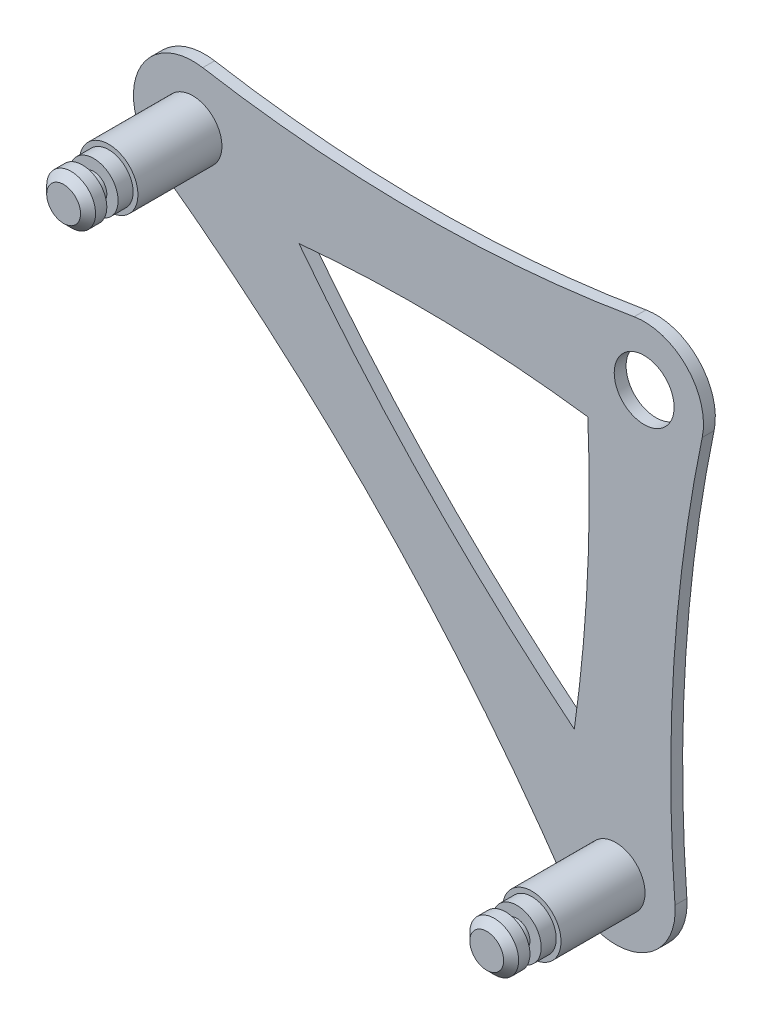
ISO-10303-21;
HEADER;
FILE_DESCRIPTION(('STEP AP214'),'2;1');
FILE_NAME('part.step','',(''),(''),'','','');
FILE_SCHEMA(('AUTOMOTIVE_DESIGN { 1 0 10303 214 1 1 1 1 }'));
ENDSEC;
DATA;
#1=APPLICATION_CONTEXT('core data for automotive mechanical design processes');
#2=APPLICATION_PROTOCOL_DEFINITION('international standard','automotive_design',2000,#1);
#3=PRODUCT_CONTEXT('',#1,'mechanical');
#4=PRODUCT('Part','Part','',(#3));
#5=PRODUCT_RELATED_PRODUCT_CATEGORY('part','',(#4));
#6=PRODUCT_DEFINITION_FORMATION('','',#4);
#7=PRODUCT_DEFINITION_CONTEXT('part definition',#1,'design');
#8=PRODUCT_DEFINITION('design','',#6,#7);
#9=PRODUCT_DEFINITION_SHAPE('','',#8);
#10=(LENGTH_UNIT() NAMED_UNIT(*) SI_UNIT(.MILLI.,.METRE.));
#11=(NAMED_UNIT(*) PLANE_ANGLE_UNIT() SI_UNIT($,.RADIAN.));
#12=(NAMED_UNIT(*) SI_UNIT($,.STERADIAN.) SOLID_ANGLE_UNIT());
#13=UNCERTAINTY_MEASURE_WITH_UNIT(LENGTH_MEASURE(1.E-05),#10,'distance_accuracy_value','');
#14=(GEOMETRIC_REPRESENTATION_CONTEXT(3) GLOBAL_UNCERTAINTY_ASSIGNED_CONTEXT((#13)) GLOBAL_UNIT_ASSIGNED_CONTEXT((#10,
#11,#12)) REPRESENTATION_CONTEXT('',''));
#15=CARTESIAN_POINT('',(0.,0.,0.));
#16=DIRECTION('',(0.,0.,1.));
#17=DIRECTION('',(1.,0.,0.));
#18=AXIS2_PLACEMENT_3D('',#15,#16,#17);
#19=CARTESIAN_POINT('',(-3.76712370962372,-57.9075960384852,18.76));
#20=DIRECTION('',(0.,0.,-1.));
#21=DIRECTION('',(-1.,0.,0.));
#22=AXIS2_PLACEMENT_3D('',#19,#20,#21);
#23=CYLINDRICAL_SURFACE('',#22,3.25);
#24=CARTESIAN_POINT('',(-3.76712370962372,-57.9075960384852,12.76));
#25=DIRECTION('',(0.,0.,1.));
#26=DIRECTION('',(1.,0.,0.));
#27=AXIS2_PLACEMENT_3D('',#24,#25,#26);
#28=CIRCLE('',#27,3.25);
#29=CARTESIAN_POINT('',(-0.517123709623721,-57.9075960384852,12.76));
#30=VERTEX_POINT('',#29);
#31=EDGE_CURVE('E211',#30,#30,#28,.T.);
#32=ORIENTED_EDGE('',*,*,#31,.T.);
#33=EDGE_LOOP('',(#32));
#34=FACE_BOUND('',#33,.T.);
#35=CARTESIAN_POINT('',(-3.76712370962372,-57.9075960384852,14.76));
#36=DIRECTION('',(0.,0.,1.));
#37=DIRECTION('',(1.,0.,0.));
#38=AXIS2_PLACEMENT_3D('',#35,#36,#37);
#39=CIRCLE('',#38,3.25);
#40=CARTESIAN_POINT('',(-0.51712370962372,-57.9075960384852,14.76));
#41=VERTEX_POINT('',#40);
#42=EDGE_CURVE('E276',#41,#41,#39,.T.);
#43=ORIENTED_EDGE('',*,*,#42,.F.);
#44=EDGE_LOOP('',(#43));
#45=FACE_BOUND('',#44,.T.);
#46=ADVANCED_FACE('F45',(#34,#45),#23,.T.);
#47=CARTESIAN_POINT('',(-60.06,0.,18.76));
#48=DIRECTION('',(0.,0.,-1.));
#49=DIRECTION('',(-1.,0.,0.));
#50=AXIS2_PLACEMENT_3D('',#47,#48,#49);
#51=CYLINDRICAL_SURFACE('',#50,3.25);
#52=CARTESIAN_POINT('',(-60.06,0.,12.76));
#53=DIRECTION('',(0.,0.,1.));
#54=DIRECTION('',(1.,0.,0.));
#55=AXIS2_PLACEMENT_3D('',#52,#53,#54);
#56=CIRCLE('',#55,3.25);
#57=CARTESIAN_POINT('',(-56.81,0.,12.76));
#58=VERTEX_POINT('',#57);
#59=EDGE_CURVE('E224',#58,#58,#56,.T.);
#60=ORIENTED_EDGE('',*,*,#59,.T.);
#61=EDGE_LOOP('',(#60));
#62=FACE_BOUND('',#61,.T.);
#63=CARTESIAN_POINT('',(-60.06,0.,14.76));
#64=DIRECTION('',(0.,0.,1.));
#65=DIRECTION('',(1.,0.,0.));
#66=AXIS2_PLACEMENT_3D('',#63,#64,#65);
#67=CIRCLE('',#66,3.25);
#68=CARTESIAN_POINT('',(-56.81,0.,14.76));
#69=VERTEX_POINT('',#68);
#70=EDGE_CURVE('E302',#69,#69,#67,.T.);
#71=ORIENTED_EDGE('',*,*,#70,.F.);
#72=EDGE_LOOP('',(#71));
#73=FACE_BOUND('',#72,.T.);
#74=ADVANCED_FACE('F244',(#62,#73),#51,.T.);
#75=CARTESIAN_POINT('',(-30.03,175.33696472792,1.58));
#76=DIRECTION('',(0.,0.,-1.));
#77=DIRECTION('',(-1.,0.,0.));
#78=AXIS2_PLACEMENT_3D('',#75,#76,#77);
#79=CYLINDRICAL_SURFACE('',#78,170.);
#80=CARTESIAN_POINT('',(-30.03,175.33696472792,0.));
#81=DIRECTION('',(0.,0.,1.));
#82=DIRECTION('',(1.,0.,0.));
#83=AXIS2_PLACEMENT_3D('',#80,#81,#82);
#84=CIRCLE('',#83,170.);
#85=CARTESIAN_POINT('',(-1.33192815785036,7.77676458318788,0.));
#86=VERTEX_POINT('',#85);
#87=CARTESIAN_POINT('',(-58.7280718421496,7.77676458318788,0.));
#88=VERTEX_POINT('',#87);
#89=EDGE_CURVE('E175',#86,#88,#84,.F.);
#90=ORIENTED_EDGE('',*,*,#89,.T.);
#91=DIRECTION('',(0.,0.,-1.));
#92=VECTOR('',#91,1.);
#93=CARTESIAN_POINT('',(-58.7280718421496,7.77676458318788,1.58));
#94=LINE('',#93,#92);
#95=CARTESIAN_POINT('',(-58.7280718421496,7.77676458318788,1.58));
#96=VERTEX_POINT('',#95);
#97=EDGE_CURVE('E207',#96,#88,#94,.T.);
#98=ORIENTED_EDGE('',*,*,#97,.F.);
#99=CARTESIAN_POINT('',(-30.03,175.33696472792,1.58));
#100=DIRECTION('',(0.,0.,1.));
#101=DIRECTION('',(1.,0.,0.));
#102=AXIS2_PLACEMENT_3D('',#99,#100,#101);
#103=CIRCLE('',#102,170.);
#104=CARTESIAN_POINT('',(-1.33192815785036,7.77676458318788,1.58));
#105=VERTEX_POINT('',#104);
#106=EDGE_CURVE('E313',#105,#96,#103,.F.);
#107=ORIENTED_EDGE('',*,*,#106,.F.);
#108=DIRECTION('',(0.,0.,-1.));
#109=VECTOR('',#108,1.);
#110=CARTESIAN_POINT('',(-1.33192815785036,7.77676458318788,1.58));
#111=LINE('',#110,#109);
#112=EDGE_CURVE('E196',#105,#86,#111,.T.);
#113=ORIENTED_EDGE('',*,*,#112,.T.);
#114=EDGE_LOOP('',(#90,#98,#107,#113));
#115=FACE_BOUND('',#114,.T.);
#116=ADVANCED_FACE('F251',(#115),#79,.F.);
#117=CARTESIAN_POINT('',(-60.06,0.,1.58));
#118=DIRECTION('',(0.,0.,-1.));
#119=DIRECTION('',(-1.,0.,0.));
#120=AXIS2_PLACEMENT_3D('',#117,#118,#119);
#121=CYLINDRICAL_SURFACE('',#120,7.89);
#122=CARTESIAN_POINT('',(-60.06,0.,0.));
#123=DIRECTION('',(0.,0.,1.));
#124=DIRECTION('',(1.,0.,0.));
#125=AXIS2_PLACEMENT_3D('',#122,#123,#124);
#126=CIRCLE('',#125,7.89);
#127=CARTESIAN_POINT('',(-64.6781402375793,-6.39725571992014,0.));
#128=VERTEX_POINT('',#127);
#129=EDGE_CURVE('E179',#88,#128,#126,.T.);
#130=ORIENTED_EDGE('',*,*,#129,.T.);
#131=DIRECTION('',(0.,0.,-1.));
#132=VECTOR('',#131,1.);
#133=CARTESIAN_POINT('',(-64.6781402375793,-6.39725571992014,1.58));
#134=LINE('',#133,#132);
#135=CARTESIAN_POINT('',(-64.6781402375793,-6.39725571992014,1.58));
#136=VERTEX_POINT('',#135);
#137=EDGE_CURVE('E203',#136,#128,#134,.T.);
#138=ORIENTED_EDGE('',*,*,#137,.F.);
#139=CARTESIAN_POINT('',(-60.06,0.,1.58));
#140=DIRECTION('',(0.,0.,1.));
#141=DIRECTION('',(1.,0.,0.));
#142=AXIS2_PLACEMENT_3D('',#139,#140,#141);
#143=CIRCLE('',#142,7.89);
#144=EDGE_CURVE('E316',#96,#136,#143,.T.);
#145=ORIENTED_EDGE('',*,*,#144,.F.);
#146=ORIENTED_EDGE('',*,*,#97,.T.);
#147=EDGE_LOOP('',(#130,#138,#145,#146));
#148=FACE_BOUND('',#147,.T.);
#149=ADVANCED_FACE('F451',(#148),#121,.T.);
#150=CARTESIAN_POINT('',(-196.374154617217,-188.828502485704,1.58));
#151=DIRECTION('',(0.,0.,-1.));
#152=DIRECTION('',(-1.,0.,0.));
#153=AXIS2_PLACEMENT_3D('',#150,#151,#152);
#154=CYLINDRICAL_SURFACE('',#153,225.);
#155=CARTESIAN_POINT('',(-196.374154617217,-188.828502485704,0.));
#156=DIRECTION('',(0.,0.,1.));
#157=DIRECTION('',(1.,0.,0.));
#158=AXIS2_PLACEMENT_3D('',#155,#156,#157);
#159=CIRCLE('',#158,225.);
#160=CARTESIAN_POINT('',(-10.2923908909579,-62.3430202811258,0.));
#161=VERTEX_POINT('',#160);
#162=EDGE_CURVE('E182',#128,#161,#159,.F.);
#163=ORIENTED_EDGE('',*,*,#162,.T.);
#164=DIRECTION('',(0.,0.,-1.));
#165=VECTOR('',#164,1.);
#166=CARTESIAN_POINT('',(-10.2923908909579,-62.3430202811258,1.58));
#167=LINE('',#166,#165);
#168=CARTESIAN_POINT('',(-10.2923908909579,-62.3430202811258,1.58));
#169=VERTEX_POINT('',#168);
#170=EDGE_CURVE('E146',#169,#161,#167,.T.);
#171=ORIENTED_EDGE('',*,*,#170,.F.);
#172=CARTESIAN_POINT('',(-196.374154617217,-188.828502485704,1.58));
#173=DIRECTION('',(0.,0.,1.));
#174=DIRECTION('',(1.,0.,0.));
#175=AXIS2_PLACEMENT_3D('',#172,#173,#174);
#176=CIRCLE('',#175,225.);
#177=EDGE_CURVE('E135',#136,#169,#176,.F.);
#178=ORIENTED_EDGE('',*,*,#177,.F.);
#179=ORIENTED_EDGE('',*,*,#137,.T.);
#180=EDGE_LOOP('',(#163,#171,#178,#179));
#181=FACE_BOUND('',#180,.T.);
#182=ADVANCED_FACE('F448',(#181),#154,.F.);
#183=CARTESIAN_POINT('',(-3.76712370962372,-57.9075960384852,1.58));
#184=DIRECTION('',(0.,0.,-1.));
#185=DIRECTION('',(-1.,0.,0.));
#186=AXIS2_PLACEMENT_3D('',#183,#184,#185);
#187=CYLINDRICAL_SURFACE('',#186,7.89);
#188=CARTESIAN_POINT('',(-3.76712370962372,-57.9075960384852,0.));
#189=DIRECTION('',(0.,0.,1.));
#190=DIRECTION('',(1.,0.,0.));
#191=AXIS2_PLACEMENT_3D('',#188,#189,#190);
#192=CIRCLE('',#191,7.89);
#193=CARTESIAN_POINT('',(4.10065843107563,-57.3159000130698,0.));
#194=VERTEX_POINT('',#193);
#195=EDGE_CURVE('E144',#161,#194,#192,.T.);
#196=ORIENTED_EDGE('',*,*,#195,.T.);
#197=DIRECTION('',(0.,0.,-1.));
#198=VECTOR('',#197,1.);
#199=CARTESIAN_POINT('',(4.10065843107563,-57.3159000130698,1.58));
#200=LINE('',#199,#198);
#201=CARTESIAN_POINT('',(4.10065843107563,-57.3159000130698,1.58));
#202=VERTEX_POINT('',#201);
#203=EDGE_CURVE('E141',#202,#194,#200,.T.);
#204=ORIENTED_EDGE('',*,*,#203,.F.);
#205=CARTESIAN_POINT('',(-3.76712370962372,-57.9075960384852,1.58));
#206=DIRECTION('',(0.,0.,1.));
#207=DIRECTION('',(1.,0.,0.));
#208=AXIS2_PLACEMENT_3D('',#205,#206,#207);
#209=CIRCLE('',#208,7.89);
#210=EDGE_CURVE('E128',#169,#202,#209,.T.);
#211=ORIENTED_EDGE('',*,*,#210,.F.);
#212=ORIENTED_EDGE('',*,*,#170,.T.);
#213=EDGE_LOOP('',(#196,#204,#211,#212));
#214=FACE_BOUND('',#213,.T.);
#215=ADVANCED_FACE('F142',(#214),#187,.T.);
#216=CARTESIAN_POINT('',(203.537468081249,-42.317268190119,1.58));
#217=DIRECTION('',(0.,0.,-1.));
#218=DIRECTION('',(-1.,0.,0.));
#219=AXIS2_PLACEMENT_3D('',#216,#217,#218);
#220=CYLINDRICAL_SURFACE('',#219,200.);
#221=CARTESIAN_POINT('',(203.537468081249,-42.317268190119,0.));
#222=DIRECTION('',(0.,0.,1.));
#223=DIRECTION('',(1.,0.,0.));
#224=AXIS2_PLACEMENT_3D('',#221,#222,#223);
#225=CIRCLE('',#224,200.);
#226=CARTESIAN_POINT('',(7.72480938554551,-1.60605727076838,0.));
#227=VERTEX_POINT('',#226);
#228=EDGE_CURVE('E96',#194,#227,#225,.F.);
#229=ORIENTED_EDGE('',*,*,#228,.T.);
#230=DIRECTION('',(0.,0.,-1.));
#231=VECTOR('',#230,1.);
#232=CARTESIAN_POINT('',(7.72480938554551,-1.60605727076838,1.58));
#233=LINE('',#232,#231);
#234=CARTESIAN_POINT('',(7.72480938554551,-1.60605727076838,1.58));
#235=VERTEX_POINT('',#234);
#236=EDGE_CURVE('E147',#235,#227,#233,.T.);
#237=ORIENTED_EDGE('',*,*,#236,.F.);
#238=CARTESIAN_POINT('',(203.537468081249,-42.317268190119,1.58));
#239=DIRECTION('',(0.,0.,1.));
#240=DIRECTION('',(1.,0.,0.));
#241=AXIS2_PLACEMENT_3D('',#238,#239,#240);
#242=CIRCLE('',#241,200.);
#243=EDGE_CURVE('E133',#202,#235,#242,.F.);
#244=ORIENTED_EDGE('',*,*,#243,.F.);
#245=ORIENTED_EDGE('',*,*,#203,.T.);
#246=EDGE_LOOP('',(#229,#237,#244,#245));
#247=FACE_BOUND('',#246,.T.);
#248=ADVANCED_FACE('F149',(#247),#220,.F.);
#249=CARTESIAN_POINT('',(132.547030907594,130.920906447219,1.58));
#250=DIRECTION('',(0.,0.,-1.));
#251=DIRECTION('',(-1.,0.,0.));
#252=AXIS2_PLACEMENT_3D('',#249,#250,#251);
#253=CYLINDRICAL_SURFACE('',#252,225.);
#254=CARTESIAN_POINT('',(132.547030907594,130.920906447219,0.));
#255=DIRECTION('',(0.,0.,1.));
#256=DIRECTION('',(1.,0.,0.));
#257=AXIS2_PLACEMENT_3D('',#254,#255,#256);
#258=CIRCLE('',#257,225.);
#259=CARTESIAN_POINT('',(-45.9329006907997,-6.08242933929762,0.));
#260=VERTEX_POINT('',#259);
#261=CARTESIAN_POINT('',(-9.29524167465698,-43.7381033653376,0.));
#262=VERTEX_POINT('',#261);
#263=EDGE_CURVE('E162',#260,#262,#258,.T.);
#264=ORIENTED_EDGE('',*,*,#263,.F.);
#265=DIRECTION('',(0.,0.,-1.));
#266=VECTOR('',#265,1.);
#267=CARTESIAN_POINT('',(-45.9329006907997,-6.08242933929762,1.58));
#268=LINE('',#267,#266);
#269=CARTESIAN_POINT('',(-45.9329006907997,-6.08242933929762,1.58));
#270=VERTEX_POINT('',#269);
#271=EDGE_CURVE('E110',#270,#260,#268,.T.);
#272=ORIENTED_EDGE('',*,*,#271,.F.);
#273=CARTESIAN_POINT('',(132.547030907594,130.920906447219,1.58));
#274=DIRECTION('',(0.,0.,1.));
#275=DIRECTION('',(1.,0.,0.));
#276=AXIS2_PLACEMENT_3D('',#273,#274,#275);
#277=CIRCLE('',#276,225.);
#278=CARTESIAN_POINT('',(-9.29524167465698,-43.7381033653376,1.58));
#279=VERTEX_POINT('',#278);
#280=EDGE_CURVE('E195',#270,#279,#277,.T.);
#281=ORIENTED_EDGE('',*,*,#280,.T.);
#282=DIRECTION('',(0.,0.,-1.));
#283=VECTOR('',#282,1.);
#284=CARTESIAN_POINT('',(-9.29524167465698,-43.7381033653376,1.58));
#285=LINE('',#284,#283);
#286=EDGE_CURVE('E161',#279,#262,#285,.T.);
#287=ORIENTED_EDGE('',*,*,#286,.T.);
#288=EDGE_LOOP('',(#264,#272,#281,#287));
#289=FACE_BOUND('',#288,.T.);
#290=ADVANCED_FACE('F445',(#289),#253,.F.);
#291=CARTESIAN_POINT('',(-30.03,-175.33696472792,1.58));
#292=DIRECTION('',(0.,0.,-1.));
#293=DIRECTION('',(-1.,0.,0.));
#294=AXIS2_PLACEMENT_3D('',#291,#292,#293);
#295=CYLINDRICAL_SURFACE('',#294,170.);
#296=CARTESIAN_POINT('',(-30.03,-175.33696472792,0.));
#297=DIRECTION('',(0.,0.,1.));
#298=DIRECTION('',(1.,0.,0.));
#299=AXIS2_PLACEMENT_3D('',#296,#297,#298);
#300=CIRCLE('',#299,170.);
#301=CARTESIAN_POINT('',(-7.49623434821273,-6.83702583905808,0.));
#302=VERTEX_POINT('',#301);
#303=EDGE_CURVE('E166',#302,#260,#300,.T.);
#304=ORIENTED_EDGE('',*,*,#303,.F.);
#305=DIRECTION('',(0.,0.,-1.));
#306=VECTOR('',#305,1.);
#307=CARTESIAN_POINT('',(-7.49623434821273,-6.83702583905808,1.58));
#308=LINE('',#307,#306);
#309=CARTESIAN_POINT('',(-7.49623434821273,-6.83702583905808,1.58));
#310=VERTEX_POINT('',#309);
#311=EDGE_CURVE('E214',#310,#302,#308,.T.);
#312=ORIENTED_EDGE('',*,*,#311,.F.);
#313=CARTESIAN_POINT('',(-30.03,-175.33696472792,1.58));
#314=DIRECTION('',(0.,0.,1.));
#315=DIRECTION('',(1.,0.,0.));
#316=AXIS2_PLACEMENT_3D('',#313,#314,#315);
#317=CIRCLE('',#316,170.);
#318=EDGE_CURVE('E305',#310,#270,#317,.T.);
#319=ORIENTED_EDGE('',*,*,#318,.T.);
#320=ORIENTED_EDGE('',*,*,#271,.T.);
#321=EDGE_LOOP('',(#304,#312,#319,#320));
#322=FACE_BOUND('',#321,.T.);
#323=ADVANCED_FACE('F442',(#322),#295,.F.);
#324=CARTESIAN_POINT('',(0.,0.,1.58));
#325=DIRECTION('',(0.,0.,-1.));
#326=DIRECTION('',(-1.,0.,0.));
#327=AXIS2_PLACEMENT_3D('',#324,#325,#326);
#328=CYLINDRICAL_SURFACE('',#327,7.89);
#329=CARTESIAN_POINT('',(0.,0.,0.));
#330=DIRECTION('',(0.,0.,1.));
#331=DIRECTION('',(1.,0.,0.));
#332=AXIS2_PLACEMENT_3D('',#329,#330,#331);
#333=CIRCLE('',#332,7.89);
#334=EDGE_CURVE('E102',#227,#86,#333,.T.);
#335=ORIENTED_EDGE('',*,*,#334,.T.);
#336=ORIENTED_EDGE('',*,*,#112,.F.);
#337=CARTESIAN_POINT('',(0.,0.,1.58));
#338=DIRECTION('',(0.,0.,1.));
#339=DIRECTION('',(1.,0.,0.));
#340=AXIS2_PLACEMENT_3D('',#337,#338,#339);
#341=CIRCLE('',#340,7.89);
#342=EDGE_CURVE('E64',#235,#105,#341,.T.);
#343=ORIENTED_EDGE('',*,*,#342,.F.);
#344=ORIENTED_EDGE('',*,*,#236,.T.);
#345=EDGE_LOOP('',(#335,#336,#343,#344));
#346=FACE_BOUND('',#345,.T.);
#347=ADVANCED_FACE('F439',(#346),#328,.T.);
#348=CARTESIAN_POINT('',(-207.304591790873,-15.5903278483662,1.58));
#349=DIRECTION('',(0.,0.,-1.));
#350=DIRECTION('',(-1.,0.,0.));
#351=AXIS2_PLACEMENT_3D('',#348,#349,#350);
#352=CYLINDRICAL_SURFACE('',#351,200.);
#353=CARTESIAN_POINT('',(-207.304591790873,-15.5903278483662,0.));
#354=DIRECTION('',(0.,0.,1.));
#355=DIRECTION('',(1.,0.,0.));
#356=AXIS2_PLACEMENT_3D('',#353,#354,#355);
#357=CIRCLE('',#356,200.);
#358=EDGE_CURVE('E171',#262,#302,#357,.T.);
#359=ORIENTED_EDGE('',*,*,#358,.F.);
#360=ORIENTED_EDGE('',*,*,#286,.F.);
#361=CARTESIAN_POINT('',(-207.304591790873,-15.5903278483662,1.58));
#362=DIRECTION('',(0.,0.,1.));
#363=DIRECTION('',(1.,0.,0.));
#364=AXIS2_PLACEMENT_3D('',#361,#362,#363);
#365=CIRCLE('',#364,200.);
#366=EDGE_CURVE('E309',#279,#310,#365,.T.);
#367=ORIENTED_EDGE('',*,*,#366,.T.);
#368=ORIENTED_EDGE('',*,*,#311,.T.);
#369=EDGE_LOOP('',(#359,#360,#367,#368));
#370=FACE_BOUND('',#369,.T.);
#371=ADVANCED_FACE('F437',(#370),#352,.F.);
#372=CARTESIAN_POINT('',(0.,0.,1.58));
#373=DIRECTION('',(0.,0.,-1.));
#374=DIRECTION('',(-1.,0.,0.));
#375=AXIS2_PLACEMENT_3D('',#372,#373,#374);
#376=CYLINDRICAL_SURFACE('',#375,3.985);
#377=CARTESIAN_POINT('',(0.,0.,1.58));
#378=DIRECTION('',(0.,0.,1.));
#379=DIRECTION('',(1.,0.,0.));
#380=AXIS2_PLACEMENT_3D('',#377,#378,#379);
#381=CIRCLE('',#380,3.985);
#382=CARTESIAN_POINT('',(-3.985,0.,1.58));
#383=VERTEX_POINT('',#382);
#384=EDGE_CURVE('E154',#383,#383,#381,.T.);
#385=CARTESIAN_POINT('',(0.,0.,0.));
#386=DIRECTION('',(0.,0.,1.));
#387=DIRECTION('',(1.,0.,0.));
#388=AXIS2_PLACEMENT_3D('',#385,#386,#387);
#389=CIRCLE('',#388,3.985);
#390=CARTESIAN_POINT('',(-3.985,0.,0.));
#391=VERTEX_POINT('',#390);
#392=EDGE_CURVE('E191',#391,#391,#389,.T.);
#393=CARTESIAN_POINT('',(-3.985,0.,1.58));
#394=CARTESIAN_POINT('',(-3.985,0.,1.56354166666667));
#395=CARTESIAN_POINT('',(-3.985,0.,1.54708333333333));
#396=CARTESIAN_POINT('',(-3.985,0.,1.51416666666667));
#397=CARTESIAN_POINT('',(-3.985,0.,1.49770833333333));
#398=CARTESIAN_POINT('',(-3.985,0.,1.46479166666667));
#399=CARTESIAN_POINT('',(-3.985,0.,1.44833333333333));
#400=CARTESIAN_POINT('',(-3.985,0.,1.41541666666667));
#401=CARTESIAN_POINT('',(-3.985,0.,1.39895833333333));
#402=CARTESIAN_POINT('',(-3.985,0.,1.36604166666667));
#403=CARTESIAN_POINT('',(-3.985,0.,1.34958333333333));
#404=CARTESIAN_POINT('',(-3.985,0.,1.31666666666667));
#405=CARTESIAN_POINT('',(-3.985,0.,1.30020833333333));
#406=CARTESIAN_POINT('',(-3.985,0.,1.26729166666667));
#407=CARTESIAN_POINT('',(-3.985,0.,1.25083333333333));
#408=CARTESIAN_POINT('',(-3.985,0.,1.21791666666667));
#409=CARTESIAN_POINT('',(-3.985,0.,1.20145833333333));
#410=CARTESIAN_POINT('',(-3.985,0.,1.16854166666667));
#411=CARTESIAN_POINT('',(-3.985,0.,1.15208333333333));
#412=CARTESIAN_POINT('',(-3.985,0.,1.11916666666667));
#413=CARTESIAN_POINT('',(-3.985,0.,1.10270833333333));
#414=CARTESIAN_POINT('',(-3.985,0.,1.06979166666667));
#415=CARTESIAN_POINT('',(-3.985,0.,1.05333333333333));
#416=CARTESIAN_POINT('',(-3.985,0.,1.02041666666667));
#417=CARTESIAN_POINT('',(-3.985,0.,1.00395833333333));
#418=CARTESIAN_POINT('',(-3.985,0.,0.971041666666667));
#419=CARTESIAN_POINT('',(-3.985,0.,0.954583333333333));
#420=CARTESIAN_POINT('',(-3.985,0.,0.921666666666667));
#421=CARTESIAN_POINT('',(-3.985,0.,0.905208333333333));
#422=CARTESIAN_POINT('',(-3.985,0.,0.872291666666667));
#423=CARTESIAN_POINT('',(-3.985,0.,0.855833333333333));
#424=CARTESIAN_POINT('',(-3.985,0.,0.822916666666667));
#425=CARTESIAN_POINT('',(-3.985,0.,0.806458333333333));
#426=CARTESIAN_POINT('',(-3.985,0.,0.773541666666667));
#427=CARTESIAN_POINT('',(-3.985,0.,0.757083333333333));
#428=CARTESIAN_POINT('',(-3.985,0.,0.724166666666667));
#429=CARTESIAN_POINT('',(-3.985,0.,0.707708333333333));
#430=CARTESIAN_POINT('',(-3.985,0.,0.674791666666667));
#431=CARTESIAN_POINT('',(-3.985,0.,0.658333333333333));
#432=CARTESIAN_POINT('',(-3.985,0.,0.625416666666667));
#433=CARTESIAN_POINT('',(-3.985,0.,0.608958333333333));
#434=CARTESIAN_POINT('',(-3.985,0.,0.576041666666667));
#435=CARTESIAN_POINT('',(-3.985,0.,0.559583333333333));
#436=CARTESIAN_POINT('',(-3.985,0.,0.526666666666667));
#437=CARTESIAN_POINT('',(-3.985,0.,0.510208333333333));
#438=CARTESIAN_POINT('',(-3.985,0.,0.477291666666667));
#439=CARTESIAN_POINT('',(-3.985,0.,0.460833333333333));
#440=CARTESIAN_POINT('',(-3.985,0.,0.427916666666667));
#441=CARTESIAN_POINT('',(-3.985,0.,0.411458333333333));
#442=CARTESIAN_POINT('',(-3.985,0.,0.378541666666667));
#443=CARTESIAN_POINT('',(-3.985,0.,0.362083333333333));
#444=CARTESIAN_POINT('',(-3.985,0.,0.329166666666667));
#445=CARTESIAN_POINT('',(-3.985,0.,0.312708333333333));
#446=CARTESIAN_POINT('',(-3.985,0.,0.279791666666667));
#447=CARTESIAN_POINT('',(-3.985,0.,0.263333333333333));
#448=CARTESIAN_POINT('',(-3.985,0.,0.230416666666667));
#449=CARTESIAN_POINT('',(-3.985,0.,0.213958333333333));
#450=CARTESIAN_POINT('',(-3.985,0.,0.181041666666667));
#451=CARTESIAN_POINT('',(-3.985,0.,0.164583333333333));
#452=CARTESIAN_POINT('',(-3.985,0.,0.131666666666667));
#453=CARTESIAN_POINT('',(-3.985,0.,0.115208333333333));
#454=CARTESIAN_POINT('',(-3.985,0.,0.0822916666666667));
#455=CARTESIAN_POINT('',(-3.985,0.,0.0658333333333333));
#456=CARTESIAN_POINT('',(-3.985,0.,0.0329166666666666));
#457=CARTESIAN_POINT('',(-3.985,0.,0.0164583333333333));
#458=CARTESIAN_POINT('',(-3.985,0.,0.));
#459=B_SPLINE_CURVE_WITH_KNOTS('',3,(#393,#394,#395,#396,#397,#398,#399,#400,#401,#402,#403,
#404,#405,#406,#407,#408,#409,#410,#411,#412,#413,#414,#415,#416,#417,#418,#419,#420,#421,#422,
#423,#424,#425,#426,#427,#428,#429,#430,#431,#432,#433,#434,#435,#436,#437,#438,#439,#440,#441,
#442,#443,#444,#445,#446,#447,#448,#449,#450,#451,#452,#453,#454,#455,#456,#457,#458),
.UNSPECIFIED.,.F.,.F.,(4,2,2,2,2,2,2,2,2,2,2,2,2,2,2,2,2,2,2,2,2,2,2,2,2,2,2,2,2,2,2,2,4),(0.,
0.0493750000000002,0.0987500000000001,0.148125,0.1975,0.246875,0.29625,0.345625,0.395,0.444375,
0.49375,0.543125,0.5925,0.641875,0.69125,0.740625,0.79,0.839375,0.88875,0.938125,0.9875,
1.036875,1.08625,1.135625,1.185,1.234375,1.28375,1.333125,1.3825,1.431875,1.48125,1.530625,
1.58),.UNSPECIFIED.);
#460=EDGE_CURVE('BSEAM430',#383,#391,#459,.T.);
#461=ORIENTED_EDGE('',*,*,#384,.T.);
#462=ORIENTED_EDGE('',*,*,#392,.F.);
#463=ORIENTED_EDGE('',*,*,#460,.T.);
#464=ORIENTED_EDGE('',*,*,#460,.F.);
#465=EDGE_LOOP('',(#461,#463,#462,#464));
#466=FACE_BOUND('',#465,.T.);
#467=ADVANCED_FACE('F430',(#466),#376,.F.);
#468=CARTESIAN_POINT('',(0.,0.,1.58));
#469=DIRECTION('',(0.,0.,1.));
#470=DIRECTION('',(1.,0.,0.));
#471=AXIS2_PLACEMENT_3D('',#468,#469,#470);
#472=PLANE('',#471);
#473=CARTESIAN_POINT('',(-3.76712370962372,-57.9075960384852,1.58));
#474=DIRECTION('',(0.,0.,1.));
#475=DIRECTION('',(1.,0.,0.));
#476=AXIS2_PLACEMENT_3D('',#473,#474,#475);
#477=CIRCLE('',#476,3.885);
#478=CARTESIAN_POINT('',(-7.65212370962372,-57.9075960384852,1.58));
#479=VERTEX_POINT('',#478);
#480=EDGE_CURVE('E290',#479,#479,#477,.T.);
#481=ORIENTED_EDGE('',*,*,#480,.F.);
#482=EDGE_LOOP('',(#481));
#483=FACE_BOUND('',#482,.T.);
#484=CARTESIAN_POINT('',(-60.06,0.,1.58));
#485=DIRECTION('',(0.,0.,1.));
#486=DIRECTION('',(1.,0.,0.));
#487=AXIS2_PLACEMENT_3D('',#484,#485,#486);
#488=CIRCLE('',#487,3.885);
#489=CARTESIAN_POINT('',(-63.945,0.,1.58));
#490=VERTEX_POINT('',#489);
#491=EDGE_CURVE('E294',#490,#490,#488,.T.);
#492=ORIENTED_EDGE('',*,*,#491,.F.);
#493=EDGE_LOOP('',(#492));
#494=FACE_BOUND('',#493,.T.);
#495=ORIENTED_EDGE('',*,*,#280,.F.);
#496=ORIENTED_EDGE('',*,*,#318,.F.);
#497=ORIENTED_EDGE('',*,*,#366,.F.);
#498=EDGE_LOOP('',(#495,#496,#497));
#499=FACE_BOUND('',#498,.T.);
#500=ORIENTED_EDGE('',*,*,#106,.T.);
#501=ORIENTED_EDGE('',*,*,#144,.T.);
#502=ORIENTED_EDGE('',*,*,#177,.T.);
#503=ORIENTED_EDGE('',*,*,#210,.T.);
#504=ORIENTED_EDGE('',*,*,#243,.T.);
#505=ORIENTED_EDGE('',*,*,#342,.T.);
#506=EDGE_LOOP('',(#500,#501,#502,#503,#504,#505));
#507=FACE_BOUND('',#506,.T.);
#508=ORIENTED_EDGE('',*,*,#384,.F.);
#509=EDGE_LOOP('',(#508));
#510=FACE_BOUND('',#509,.T.);
#511=ADVANCED_FACE('F130',(#483,#494,#499,#507,#510),#472,.T.);
#512=CARTESIAN_POINT('',(0.,0.,0.));
#513=DIRECTION('',(0.,0.,1.));
#514=DIRECTION('',(1.,0.,0.));
#515=AXIS2_PLACEMENT_3D('',#512,#513,#514);
#516=PLANE('',#515);
#517=ORIENTED_EDGE('',*,*,#263,.T.);
#518=ORIENTED_EDGE('',*,*,#358,.T.);
#519=ORIENTED_EDGE('',*,*,#303,.T.);
#520=EDGE_LOOP('',(#517,#518,#519));
#521=FACE_BOUND('',#520,.T.);
#522=ORIENTED_EDGE('',*,*,#89,.F.);
#523=ORIENTED_EDGE('',*,*,#334,.F.);
#524=ORIENTED_EDGE('',*,*,#228,.F.);
#525=ORIENTED_EDGE('',*,*,#195,.F.);
#526=ORIENTED_EDGE('',*,*,#162,.F.);
#527=ORIENTED_EDGE('',*,*,#129,.F.);
#528=EDGE_LOOP('',(#522,#523,#524,#525,#526,#527));
#529=FACE_BOUND('',#528,.T.);
#530=ORIENTED_EDGE('',*,*,#392,.T.);
#531=EDGE_LOOP('',(#530));
#532=FACE_BOUND('',#531,.T.);
#533=ADVANCED_FACE('F423',(#521,#529,#532),#516,.F.);
#534=CARTESIAN_POINT('',(-60.06,0.,12.76));
#535=DIRECTION('',(0.,0.,-1.));
#536=DIRECTION('',(-1.,0.,0.));
#537=AXIS2_PLACEMENT_3D('',#534,#535,#536);
#538=CYLINDRICAL_SURFACE('',#537,3.885);
#539=CARTESIAN_POINT('',(-60.06,0.,12.76));
#540=DIRECTION('',(0.,0.,1.));
#541=DIRECTION('',(1.,0.,0.));
#542=AXIS2_PLACEMENT_3D('',#539,#540,#541);
#543=CIRCLE('',#542,3.885);
#544=CARTESIAN_POINT('',(-63.945,0.,12.76));
#545=VERTEX_POINT('',#544);
#546=EDGE_CURVE('E298',#545,#545,#543,.T.);
#547=CARTESIAN_POINT('',(-63.945,0.,12.76));
#548=CARTESIAN_POINT('',(-63.945,0.,12.6435416666667));
#549=CARTESIAN_POINT('',(-63.945,0.,12.5270833333333));
#550=CARTESIAN_POINT('',(-63.945,0.,12.2941666666667));
#551=CARTESIAN_POINT('',(-63.945,0.,12.1777083333333));
#552=CARTESIAN_POINT('',(-63.945,0.,11.9447916666667));
#553=CARTESIAN_POINT('',(-63.945,0.,11.8283333333333));
#554=CARTESIAN_POINT('',(-63.945,0.,11.5954166666667));
#555=CARTESIAN_POINT('',(-63.945,0.,11.4789583333333));
#556=CARTESIAN_POINT('',(-63.945,0.,11.2460416666667));
#557=CARTESIAN_POINT('',(-63.945,0.,11.1295833333333));
#558=CARTESIAN_POINT('',(-63.945,0.,10.8966666666667));
#559=CARTESIAN_POINT('',(-63.945,0.,10.7802083333333));
#560=CARTESIAN_POINT('',(-63.945,0.,10.5472916666667));
#561=CARTESIAN_POINT('',(-63.945,0.,10.4308333333333));
#562=CARTESIAN_POINT('',(-63.945,0.,10.1979166666667));
#563=CARTESIAN_POINT('',(-63.945,0.,10.0814583333333));
#564=CARTESIAN_POINT('',(-63.945,0.,9.84854166666667));
#565=CARTESIAN_POINT('',(-63.945,0.,9.73208333333333));
#566=CARTESIAN_POINT('',(-63.945,0.,9.49916666666667));
#567=CARTESIAN_POINT('',(-63.945,0.,9.38270833333333));
#568=CARTESIAN_POINT('',(-63.945,0.,9.14979166666667));
#569=CARTESIAN_POINT('',(-63.945,0.,9.03333333333333));
#570=CARTESIAN_POINT('',(-63.945,0.,8.80041666666667));
#571=CARTESIAN_POINT('',(-63.945,0.,8.68395833333333));
#572=CARTESIAN_POINT('',(-63.945,0.,8.45104166666667));
#573=CARTESIAN_POINT('',(-63.945,0.,8.33458333333333));
#574=CARTESIAN_POINT('',(-63.945,0.,8.10166666666667));
#575=CARTESIAN_POINT('',(-63.945,0.,7.98520833333333));
#576=CARTESIAN_POINT('',(-63.945,0.,7.75229166666667));
#577=CARTESIAN_POINT('',(-63.945,0.,7.63583333333333));
#578=CARTESIAN_POINT('',(-63.945,0.,7.40291666666667));
#579=CARTESIAN_POINT('',(-63.945,0.,7.28645833333333));
#580=CARTESIAN_POINT('',(-63.945,0.,7.05354166666667));
#581=CARTESIAN_POINT('',(-63.945,0.,6.93708333333333));
#582=CARTESIAN_POINT('',(-63.945,0.,6.70416666666667));
#583=CARTESIAN_POINT('',(-63.945,0.,6.58770833333333));
#584=CARTESIAN_POINT('',(-63.945,0.,6.35479166666667));
#585=CARTESIAN_POINT('',(-63.945,0.,6.23833333333333));
#586=CARTESIAN_POINT('',(-63.945,0.,6.00541666666667));
#587=CARTESIAN_POINT('',(-63.945,0.,5.88895833333333));
#588=CARTESIAN_POINT('',(-63.945,0.,5.65604166666667));
#589=CARTESIAN_POINT('',(-63.945,0.,5.53958333333333));
#590=CARTESIAN_POINT('',(-63.945,0.,5.30666666666667));
#591=CARTESIAN_POINT('',(-63.945,0.,5.19020833333333));
#592=CARTESIAN_POINT('',(-63.945,0.,4.95729166666667));
#593=CARTESIAN_POINT('',(-63.945,0.,4.84083333333333));
#594=CARTESIAN_POINT('',(-63.945,0.,4.60791666666667));
#595=CARTESIAN_POINT('',(-63.945,0.,4.49145833333333));
#596=CARTESIAN_POINT('',(-63.945,0.,4.25854166666667));
#597=CARTESIAN_POINT('',(-63.945,0.,4.14208333333333));
#598=CARTESIAN_POINT('',(-63.945,0.,3.90916666666667));
#599=CARTESIAN_POINT('',(-63.945,0.,3.79270833333333));
#600=CARTESIAN_POINT('',(-63.945,0.,3.55979166666667));
#601=CARTESIAN_POINT('',(-63.945,0.,3.44333333333333));
#602=CARTESIAN_POINT('',(-63.945,0.,3.21041666666667));
#603=CARTESIAN_POINT('',(-63.945,0.,3.09395833333333));
#604=CARTESIAN_POINT('',(-63.945,0.,2.86104166666667));
#605=CARTESIAN_POINT('',(-63.945,0.,2.74458333333334));
#606=CARTESIAN_POINT('',(-63.945,0.,2.51166666666667));
#607=CARTESIAN_POINT('',(-63.945,0.,2.39520833333333));
#608=CARTESIAN_POINT('',(-63.945,0.,2.16229166666667));
#609=CARTESIAN_POINT('',(-63.945,0.,2.04583333333334));
#610=CARTESIAN_POINT('',(-63.945,0.,1.81291666666667));
#611=CARTESIAN_POINT('',(-63.945,0.,1.69645833333334));
#612=CARTESIAN_POINT('',(-63.945,0.,1.58));
#613=B_SPLINE_CURVE_WITH_KNOTS('',3,(#547,#548,#549,#550,#551,#552,#553,#554,#555,#556,#557,
#558,#559,#560,#561,#562,#563,#564,#565,#566,#567,#568,#569,#570,#571,#572,#573,#574,#575,#576,
#577,#578,#579,#580,#581,#582,#583,#584,#585,#586,#587,#588,#589,#590,#591,#592,#593,#594,#595,
#596,#597,#598,#599,#600,#601,#602,#603,#604,#605,#606,#607,#608,#609,#610,#611,#612),
.UNSPECIFIED.,.F.,.F.,(4,2,2,2,2,2,2,2,2,2,2,2,2,2,2,2,2,2,2,2,2,2,2,2,2,2,2,2,2,2,2,2,4),(0.,
0.349374999999999,0.698749999999998,1.048125,1.3975,1.746875,2.09625,2.445625,2.795,3.144375,
3.49375,3.843125,4.1925,4.541875,4.89125,5.240625,5.59,5.939375,6.28875,6.638125,6.9875,
7.336875,7.68625,8.035625,8.385,8.734375,9.08375,9.433125,9.7825,10.131875,10.48125,10.830625,
11.18),.UNSPECIFIED.);
#614=EDGE_CURVE('BSEAM420',#545,#490,#613,.T.);
#615=ORIENTED_EDGE('',*,*,#546,.F.);
#616=ORIENTED_EDGE('',*,*,#491,.T.);
#617=ORIENTED_EDGE('',*,*,#614,.T.);
#618=ORIENTED_EDGE('',*,*,#614,.F.);
#619=EDGE_LOOP('',(#615,#617,#616,#618));
#620=FACE_BOUND('',#619,.T.);
#621=ADVANCED_FACE('F420',(#620),#538,.T.);
#622=CARTESIAN_POINT('',(-60.06,0.,12.76));
#623=DIRECTION('',(0.,0.,1.));
#624=DIRECTION('',(1.,0.,0.));
#625=AXIS2_PLACEMENT_3D('',#622,#623,#624);
#626=PLANE('',#625);
#627=ORIENTED_EDGE('',*,*,#59,.F.);
#628=EDGE_LOOP('',(#627));
#629=FACE_BOUND('',#628,.T.);
#630=ORIENTED_EDGE('',*,*,#546,.T.);
#631=EDGE_LOOP('',(#630));
#632=FACE_BOUND('',#631,.T.);
#633=ADVANCED_FACE('F418',(#629,#632),#626,.T.);
#634=CARTESIAN_POINT('',(-3.76712370962372,-57.9075960384852,12.76));
#635=DIRECTION('',(0.,0.,-1.));
#636=DIRECTION('',(-1.,0.,0.));
#637=AXIS2_PLACEMENT_3D('',#634,#635,#636);
#638=CYLINDRICAL_SURFACE('',#637,3.885);
#639=CARTESIAN_POINT('',(-3.76712370962372,-57.9075960384852,12.76));
#640=DIRECTION('',(0.,0.,1.));
#641=DIRECTION('',(1.,0.,0.));
#642=AXIS2_PLACEMENT_3D('',#639,#640,#641);
#643=CIRCLE('',#642,3.885);
#644=CARTESIAN_POINT('',(-7.65212370962372,-57.9075960384852,12.76));
#645=VERTEX_POINT('',#644);
#646=EDGE_CURVE('E167',#645,#645,#643,.T.);
#647=CARTESIAN_POINT('',(-7.65212370962372,-57.9075960384852,12.76));
#648=CARTESIAN_POINT('',(-7.65212370962372,-57.9075960384852,12.6435416666667));
#649=CARTESIAN_POINT('',(-7.65212370962372,-57.9075960384852,12.5270833333333));
#650=CARTESIAN_POINT('',(-7.65212370962372,-57.9075960384852,12.2941666666667));
#651=CARTESIAN_POINT('',(-7.65212370962372,-57.9075960384852,12.1777083333333));
#652=CARTESIAN_POINT('',(-7.65212370962372,-57.9075960384852,11.9447916666667));
#653=CARTESIAN_POINT('',(-7.65212370962372,-57.9075960384852,11.8283333333333));
#654=CARTESIAN_POINT('',(-7.65212370962372,-57.9075960384852,11.5954166666667));
#655=CARTESIAN_POINT('',(-7.65212370962372,-57.9075960384852,11.4789583333333));
#656=CARTESIAN_POINT('',(-7.65212370962372,-57.9075960384852,11.2460416666667));
#657=CARTESIAN_POINT('',(-7.65212370962372,-57.9075960384852,11.1295833333333));
#658=CARTESIAN_POINT('',(-7.65212370962372,-57.9075960384852,10.8966666666667));
#659=CARTESIAN_POINT('',(-7.65212370962372,-57.9075960384852,10.7802083333333));
#660=CARTESIAN_POINT('',(-7.65212370962372,-57.9075960384852,10.5472916666667));
#661=CARTESIAN_POINT('',(-7.65212370962372,-57.9075960384852,10.4308333333333));
#662=CARTESIAN_POINT('',(-7.65212370962372,-57.9075960384852,10.1979166666667));
#663=CARTESIAN_POINT('',(-7.65212370962372,-57.9075960384852,10.0814583333333));
#664=CARTESIAN_POINT('',(-7.65212370962372,-57.9075960384852,9.84854166666667));
#665=CARTESIAN_POINT('',(-7.65212370962372,-57.9075960384852,9.73208333333333));
#666=CARTESIAN_POINT('',(-7.65212370962372,-57.9075960384852,9.49916666666667));
#667=CARTESIAN_POINT('',(-7.65212370962372,-57.9075960384852,9.38270833333333));
#668=CARTESIAN_POINT('',(-7.65212370962372,-57.9075960384852,9.14979166666667));
#669=CARTESIAN_POINT('',(-7.65212370962372,-57.9075960384852,9.03333333333333));
#670=CARTESIAN_POINT('',(-7.65212370962372,-57.9075960384852,8.80041666666667));
#671=CARTESIAN_POINT('',(-7.65212370962372,-57.9075960384852,8.68395833333333));
#672=CARTESIAN_POINT('',(-7.65212370962372,-57.9075960384852,8.45104166666667));
#673=CARTESIAN_POINT('',(-7.65212370962372,-57.9075960384852,8.33458333333333));
#674=CARTESIAN_POINT('',(-7.65212370962372,-57.9075960384852,8.10166666666667));
#675=CARTESIAN_POINT('',(-7.65212370962372,-57.9075960384852,7.98520833333333));
#676=CARTESIAN_POINT('',(-7.65212370962372,-57.9075960384852,7.75229166666667));
#677=CARTESIAN_POINT('',(-7.65212370962372,-57.9075960384852,7.63583333333333));
#678=CARTESIAN_POINT('',(-7.65212370962372,-57.9075960384852,7.40291666666667));
#679=CARTESIAN_POINT('',(-7.65212370962372,-57.9075960384852,7.28645833333333));
#680=CARTESIAN_POINT('',(-7.65212370962372,-57.9075960384852,7.05354166666667));
#681=CARTESIAN_POINT('',(-7.65212370962372,-57.9075960384852,6.93708333333333));
#682=CARTESIAN_POINT('',(-7.65212370962372,-57.9075960384852,6.70416666666667));
#683=CARTESIAN_POINT('',(-7.65212370962372,-57.9075960384852,6.58770833333333));
#684=CARTESIAN_POINT('',(-7.65212370962372,-57.9075960384852,6.35479166666667));
#685=CARTESIAN_POINT('',(-7.65212370962372,-57.9075960384852,6.23833333333333));
#686=CARTESIAN_POINT('',(-7.65212370962372,-57.9075960384852,6.00541666666667));
#687=CARTESIAN_POINT('',(-7.65212370962372,-57.9075960384852,5.88895833333333));
#688=CARTESIAN_POINT('',(-7.65212370962372,-57.9075960384852,5.65604166666667));
#689=CARTESIAN_POINT('',(-7.65212370962372,-57.9075960384852,5.53958333333333));
#690=CARTESIAN_POINT('',(-7.65212370962372,-57.9075960384852,5.30666666666667));
#691=CARTESIAN_POINT('',(-7.65212370962372,-57.9075960384852,5.19020833333333));
#692=CARTESIAN_POINT('',(-7.65212370962372,-57.9075960384852,4.95729166666667));
#693=CARTESIAN_POINT('',(-7.65212370962372,-57.9075960384852,4.84083333333333));
#694=CARTESIAN_POINT('',(-7.65212370962372,-57.9075960384852,4.60791666666667));
#695=CARTESIAN_POINT('',(-7.65212370962372,-57.9075960384852,4.49145833333333));
#696=CARTESIAN_POINT('',(-7.65212370962372,-57.9075960384852,4.25854166666667));
#697=CARTESIAN_POINT('',(-7.65212370962372,-57.9075960384852,4.14208333333333));
#698=CARTESIAN_POINT('',(-7.65212370962372,-57.9075960384852,3.90916666666667));
#699=CARTESIAN_POINT('',(-7.65212370962372,-57.9075960384852,3.79270833333333));
#700=CARTESIAN_POINT('',(-7.65212370962372,-57.9075960384852,3.55979166666667));
#701=CARTESIAN_POINT('',(-7.65212370962372,-57.9075960384852,3.44333333333333));
#702=CARTESIAN_POINT('',(-7.65212370962372,-57.9075960384852,3.21041666666667));
#703=CARTESIAN_POINT('',(-7.65212370962372,-57.9075960384852,3.09395833333333));
#704=CARTESIAN_POINT('',(-7.65212370962372,-57.9075960384852,2.86104166666667));
#705=CARTESIAN_POINT('',(-7.65212370962372,-57.9075960384852,2.74458333333334));
#706=CARTESIAN_POINT('',(-7.65212370962372,-57.9075960384852,2.51166666666667));
#707=CARTESIAN_POINT('',(-7.65212370962372,-57.9075960384852,2.39520833333333));
#708=CARTESIAN_POINT('',(-7.65212370962372,-57.9075960384852,2.16229166666667));
#709=CARTESIAN_POINT('',(-7.65212370962372,-57.9075960384852,2.04583333333334));
#710=CARTESIAN_POINT('',(-7.65212370962372,-57.9075960384852,1.81291666666667));
#711=CARTESIAN_POINT('',(-7.65212370962372,-57.9075960384852,1.69645833333334));
#712=CARTESIAN_POINT('',(-7.65212370962372,-57.9075960384852,1.58));
#713=B_SPLINE_CURVE_WITH_KNOTS('',3,(#647,#648,#649,#650,#651,#652,#653,#654,#655,#656,#657,
#658,#659,#660,#661,#662,#663,#664,#665,#666,#667,#668,#669,#670,#671,#672,#673,#674,#675,#676,
#677,#678,#679,#680,#681,#682,#683,#684,#685,#686,#687,#688,#689,#690,#691,#692,#693,#694,#695,
#696,#697,#698,#699,#700,#701,#702,#703,#704,#705,#706,#707,#708,#709,#710,#711,#712),
.UNSPECIFIED.,.F.,.F.,(4,2,2,2,2,2,2,2,2,2,2,2,2,2,2,2,2,2,2,2,2,2,2,2,2,2,2,2,2,2,2,2,4),(0.,
0.349374999999999,0.698749999999998,1.048125,1.3975,1.746875,2.09625,2.445625,2.795,3.144375,
3.49375,3.843125,4.1925,4.541875,4.89125,5.240625,5.59,5.939375,6.28875,6.638125,6.9875,
7.336875,7.68625,8.035625,8.385,8.734375,9.08375,9.433125,9.7825,10.131875,10.48125,10.830625,
11.18),.UNSPECIFIED.);
#714=EDGE_CURVE('BSEAM414',#645,#479,#713,.T.);
#715=ORIENTED_EDGE('',*,*,#646,.F.);
#716=ORIENTED_EDGE('',*,*,#480,.T.);
#717=ORIENTED_EDGE('',*,*,#714,.T.);
#718=ORIENTED_EDGE('',*,*,#714,.F.);
#719=EDGE_LOOP('',(#715,#717,#716,#718));
#720=FACE_BOUND('',#719,.T.);
#721=ADVANCED_FACE('F414',(#720),#638,.T.);
#722=CARTESIAN_POINT('',(-3.76712370962372,-57.9075960384852,12.76));
#723=DIRECTION('',(0.,0.,1.));
#724=DIRECTION('',(1.,0.,0.));
#725=AXIS2_PLACEMENT_3D('',#722,#723,#724);
#726=PLANE('',#725);
#727=ORIENTED_EDGE('',*,*,#31,.F.);
#728=EDGE_LOOP('',(#727));
#729=FACE_BOUND('',#728,.T.);
#730=ORIENTED_EDGE('',*,*,#646,.T.);
#731=EDGE_LOOP('',(#730));
#732=FACE_BOUND('',#731,.T.);
#733=ADVANCED_FACE('F387',(#729,#732),#726,.T.);
#734=CARTESIAN_POINT('',(-60.06,0.,14.76));
#735=DIRECTION('',(0.,0.,1.));
#736=DIRECTION('',(1.,0.,0.));
#737=AXIS2_PLACEMENT_3D('',#734,#735,#736);
#738=CYLINDRICAL_SURFACE('',#737,1.75);
#739=CARTESIAN_POINT('',(-60.06,0.,14.76));
#740=DIRECTION('',(0.,0.,1.));
#741=DIRECTION('',(1.,0.,0.));
#742=AXIS2_PLACEMENT_3D('',#739,#740,#741);
#743=CIRCLE('',#742,1.75);
#744=CARTESIAN_POINT('',(-58.31,0.,14.76));
#745=VERTEX_POINT('',#744);
#746=EDGE_CURVE('E344',#745,#745,#743,.T.);
#747=ORIENTED_EDGE('',*,*,#746,.T.);
#748=EDGE_LOOP('',(#747));
#749=FACE_BOUND('',#748,.T.);
#750=CARTESIAN_POINT('',(-60.06,0.,16.26));
#751=DIRECTION('',(0.,0.,1.));
#752=DIRECTION('',(1.,0.,0.));
#753=AXIS2_PLACEMENT_3D('',#750,#751,#752);
#754=CIRCLE('',#753,1.75);
#755=CARTESIAN_POINT('',(-58.31,0.,16.26));
#756=VERTEX_POINT('',#755);
#757=EDGE_CURVE('E354',#756,#756,#754,.T.);
#758=ORIENTED_EDGE('',*,*,#757,.F.);
#759=EDGE_LOOP('',(#758));
#760=FACE_BOUND('',#759,.T.);
#761=ADVANCED_FACE('F383',(#749,#760),#738,.T.);
#762=CARTESIAN_POINT('',(0.,0.,14.76));
#763=DIRECTION('',(0.,0.,1.));
#764=DIRECTION('',(1.,0.,0.));
#765=AXIS2_PLACEMENT_3D('',#762,#763,#764);
#766=PLANE('',#765);
#767=ORIENTED_EDGE('',*,*,#746,.F.);
#768=EDGE_LOOP('',(#767));
#769=FACE_BOUND('',#768,.T.);
#770=ORIENTED_EDGE('',*,*,#70,.T.);
#771=EDGE_LOOP('',(#770));
#772=FACE_BOUND('',#771,.T.);
#773=ADVANCED_FACE('F386',(#769,#772),#766,.T.);
#774=CARTESIAN_POINT('',(0.,0.,16.26));
#775=DIRECTION('',(0.,0.,1.));
#776=DIRECTION('',(1.,0.,0.));
#777=AXIS2_PLACEMENT_3D('',#774,#775,#776);
#778=PLANE('',#777);
#779=ORIENTED_EDGE('',*,*,#757,.T.);
#780=EDGE_LOOP('',(#779));
#781=FACE_BOUND('',#780,.T.);
#782=CARTESIAN_POINT('',(-60.06,0.,16.26));
#783=DIRECTION('',(0.,0.,1.));
#784=DIRECTION('',(1.,0.,0.));
#785=AXIS2_PLACEMENT_3D('',#782,#783,#784);
#786=CIRCLE('',#785,3.25);
#787=CARTESIAN_POINT('',(-56.81,0.,16.26));
#788=VERTEX_POINT('',#787);
#789=EDGE_CURVE('E349',#788,#788,#786,.T.);
#790=ORIENTED_EDGE('',*,*,#789,.F.);
#791=EDGE_LOOP('',(#790));
#792=FACE_BOUND('',#791,.T.);
#793=ADVANCED_FACE('F378',(#781,#792),#778,.F.);
#794=CARTESIAN_POINT('',(-3.76712370962372,-57.9075960384852,14.76));
#795=DIRECTION('',(0.,0.,1.));
#796=DIRECTION('',(1.,0.,0.));
#797=AXIS2_PLACEMENT_3D('',#794,#795,#796);
#798=CYLINDRICAL_SURFACE('',#797,1.75);
#799=CARTESIAN_POINT('',(-3.76712370962372,-57.9075960384852,14.76));
#800=DIRECTION('',(0.,0.,1.));
#801=DIRECTION('',(1.,0.,0.));
#802=AXIS2_PLACEMENT_3D('',#799,#800,#801);
#803=CIRCLE('',#802,1.75);
#804=CARTESIAN_POINT('',(-2.01712370962372,-57.9075960384852,14.76));
#805=VERTEX_POINT('',#804);
#806=EDGE_CURVE('E269',#805,#805,#803,.T.);
#807=ORIENTED_EDGE('',*,*,#806,.T.);
#808=EDGE_LOOP('',(#807));
#809=FACE_BOUND('',#808,.T.);
#810=CARTESIAN_POINT('',(-3.76712370962372,-57.9075960384852,16.26));
#811=DIRECTION('',(0.,0.,1.));
#812=DIRECTION('',(1.,0.,0.));
#813=AXIS2_PLACEMENT_3D('',#810,#811,#812);
#814=CIRCLE('',#813,1.75);
#815=CARTESIAN_POINT('',(-2.01712370962372,-57.9075960384852,16.26));
#816=VERTEX_POINT('',#815);
#817=EDGE_CURVE('E270',#816,#816,#814,.T.);
#818=ORIENTED_EDGE('',*,*,#817,.F.);
#819=EDGE_LOOP('',(#818));
#820=FACE_BOUND('',#819,.T.);
#821=ADVANCED_FACE('F368',(#809,#820),#798,.T.);
#822=CARTESIAN_POINT('',(0.,0.,14.76));
#823=DIRECTION('',(0.,0.,1.));
#824=DIRECTION('',(1.,0.,0.));
#825=AXIS2_PLACEMENT_3D('',#822,#823,#824);
#826=PLANE('',#825);
#827=ORIENTED_EDGE('',*,*,#806,.F.);
#828=EDGE_LOOP('',(#827));
#829=FACE_BOUND('',#828,.T.);
#830=ORIENTED_EDGE('',*,*,#42,.T.);
#831=EDGE_LOOP('',(#830));
#832=FACE_BOUND('',#831,.T.);
#833=ADVANCED_FACE('F365',(#829,#832),#826,.T.);
#834=CARTESIAN_POINT('',(0.,0.,16.26));
#835=DIRECTION('',(0.,0.,1.));
#836=DIRECTION('',(1.,0.,0.));
#837=AXIS2_PLACEMENT_3D('',#834,#835,#836);
#838=PLANE('',#837);
#839=ORIENTED_EDGE('',*,*,#817,.T.);
#840=EDGE_LOOP('',(#839));
#841=FACE_BOUND('',#840,.T.);
#842=CARTESIAN_POINT('',(-3.76712370962372,-57.9075960384852,16.26));
#843=DIRECTION('',(0.,0.,1.));
#844=DIRECTION('',(1.,0.,0.));
#845=AXIS2_PLACEMENT_3D('',#842,#843,#844);
#846=CIRCLE('',#845,3.25);
#847=CARTESIAN_POINT('',(-0.51712370962372,-57.9075960384852,16.26));
#848=VERTEX_POINT('',#847);
#849=EDGE_CURVE('E266',#848,#848,#846,.T.);
#850=ORIENTED_EDGE('',*,*,#849,.F.);
#851=EDGE_LOOP('',(#850));
#852=FACE_BOUND('',#851,.T.);
#853=ADVANCED_FACE('F367',(#841,#852),#838,.F.);
#854=CARTESIAN_POINT('',(-60.06,0.,18.76));
#855=DIRECTION('',(0.,0.,1.));
#856=DIRECTION('',(1.,0.,0.));
#857=AXIS2_PLACEMENT_3D('',#854,#855,#856);
#858=PLANE('',#857);
#859=CARTESIAN_POINT('',(-60.06,0.,18.76));
#860=DIRECTION('',(0.,0.,1.));
#861=DIRECTION('',(1.,0.,0.));
#862=AXIS2_PLACEMENT_3D('',#859,#860,#861);
#863=CIRCLE('',#862,2.25);
#864=CARTESIAN_POINT('',(-57.81,0.,18.76));
#865=VERTEX_POINT('',#864);
#866=EDGE_CURVE('E219',#865,#865,#863,.T.);
#867=ORIENTED_EDGE('',*,*,#866,.T.);
#868=EDGE_LOOP('',(#867));
#869=FACE_BOUND('',#868,.T.);
#870=ADVANCED_FACE('F375',(#869),#858,.T.);
#871=CARTESIAN_POINT('',(-60.06,0.,17.76));
#872=DIRECTION('',(0.,0.,1.));
#873=DIRECTION('',(1.,0.,0.));
#874=AXIS2_PLACEMENT_3D('',#871,#872,#873);
#875=CIRCLE('',#874,3.25);
#876=CARTESIAN_POINT('',(-56.81,0.,17.76));
#877=VERTEX_POINT('',#876);
#878=EDGE_CURVE('E223',#877,#877,#875,.F.);
#879=ORIENTED_EDGE('',*,*,#878,.T.);
#880=EDGE_LOOP('',(#879));
#881=FACE_BOUND('',#880,.T.);
#882=ORIENTED_EDGE('',*,*,#789,.T.);
#883=EDGE_LOOP('',(#882));
#884=FACE_BOUND('',#883,.T.);
#885=ADVANCED_FACE('F254',(#881,#884),#51,.T.);
#886=CARTESIAN_POINT('',(-3.76712370962372,-57.9075960384852,18.76));
#887=DIRECTION('',(0.,0.,1.));
#888=DIRECTION('',(1.,0.,0.));
#889=AXIS2_PLACEMENT_3D('',#886,#887,#888);
#890=PLANE('',#889);
#891=CARTESIAN_POINT('',(-3.76712370962372,-57.9075960384852,18.76));
#892=DIRECTION('',(0.,0.,1.));
#893=DIRECTION('',(1.,0.,0.));
#894=AXIS2_PLACEMENT_3D('',#891,#892,#893);
#895=CIRCLE('',#894,2.25);
#896=CARTESIAN_POINT('',(-1.51712370962372,-57.9075960384852,18.76));
#897=VERTEX_POINT('',#896);
#898=EDGE_CURVE('E56',#897,#897,#895,.T.);
#899=ORIENTED_EDGE('',*,*,#898,.T.);
#900=EDGE_LOOP('',(#899));
#901=FACE_BOUND('',#900,.T.);
#902=ADVANCED_FACE('F232',(#901),#890,.T.);
#903=CARTESIAN_POINT('',(-3.76712370962372,-57.9075960384852,17.76));
#904=DIRECTION('',(0.,0.,1.));
#905=DIRECTION('',(1.,0.,0.));
#906=AXIS2_PLACEMENT_3D('',#903,#904,#905);
#907=CIRCLE('',#906,3.25);
#908=CARTESIAN_POINT('',(-0.517123709623721,-57.9075960384852,17.76));
#909=VERTEX_POINT('',#908);
#910=EDGE_CURVE('E11',#909,#909,#907,.F.);
#911=ORIENTED_EDGE('',*,*,#910,.T.);
#912=EDGE_LOOP('',(#911));
#913=FACE_BOUND('',#912,.T.);
#914=ORIENTED_EDGE('',*,*,#849,.T.);
#915=EDGE_LOOP('',(#914));
#916=FACE_BOUND('',#915,.T.);
#917=ADVANCED_FACE('F240',(#913,#916),#23,.T.);
#918=CARTESIAN_POINT('',(-60.06,0.,18.76));
#919=DIRECTION('',(0.,0.,-1.));
#920=DIRECTION('',(-1.,0.,0.));
#921=AXIS2_PLACEMENT_3D('',#918,#919,#920);
#922=CONICAL_SURFACE('',#921,2.25,0.785398163397447);
#923=ORIENTED_EDGE('',*,*,#878,.F.);
#924=EDGE_LOOP('',(#923));
#925=FACE_BOUND('',#924,.T.);
#926=ORIENTED_EDGE('',*,*,#866,.F.);
#927=EDGE_LOOP('',(#926));
#928=FACE_BOUND('',#927,.T.);
#929=ADVANCED_FACE('F235',(#925,#928),#922,.T.);
#930=CARTESIAN_POINT('',(-3.76712370962372,-57.9075960384852,18.76));
#931=DIRECTION('',(0.,0.,-1.));
#932=DIRECTION('',(-1.,0.,0.));
#933=AXIS2_PLACEMENT_3D('',#930,#931,#932);
#934=CONICAL_SURFACE('',#933,2.25,0.785398163397449);
#935=ORIENTED_EDGE('',*,*,#910,.F.);
#936=EDGE_LOOP('',(#935));
#937=FACE_BOUND('',#936,.T.);
#938=ORIENTED_EDGE('',*,*,#898,.F.);
#939=EDGE_LOOP('',(#938));
#940=FACE_BOUND('',#939,.T.);
#941=ADVANCED_FACE('F48',(#937,#940),#934,.T.);
#942=CLOSED_SHELL('',(#46,#74,#116,#149,#182,#215,#248,#290,#323,#347,#371,#467,#511,#533,#621,
#633,#721,#733,#761,#773,#793,#821,#833,#853,#870,#885,#902,#917,#929,#941));
#943=MANIFOLD_SOLID_BREP('B2',#942);
#944=ADVANCED_BREP_SHAPE_REPRESENTATION('',(#18,#943),#14);
#945=SHAPE_DEFINITION_REPRESENTATION(#9,#944);
ENDSEC;
END-ISO-10303-21;
